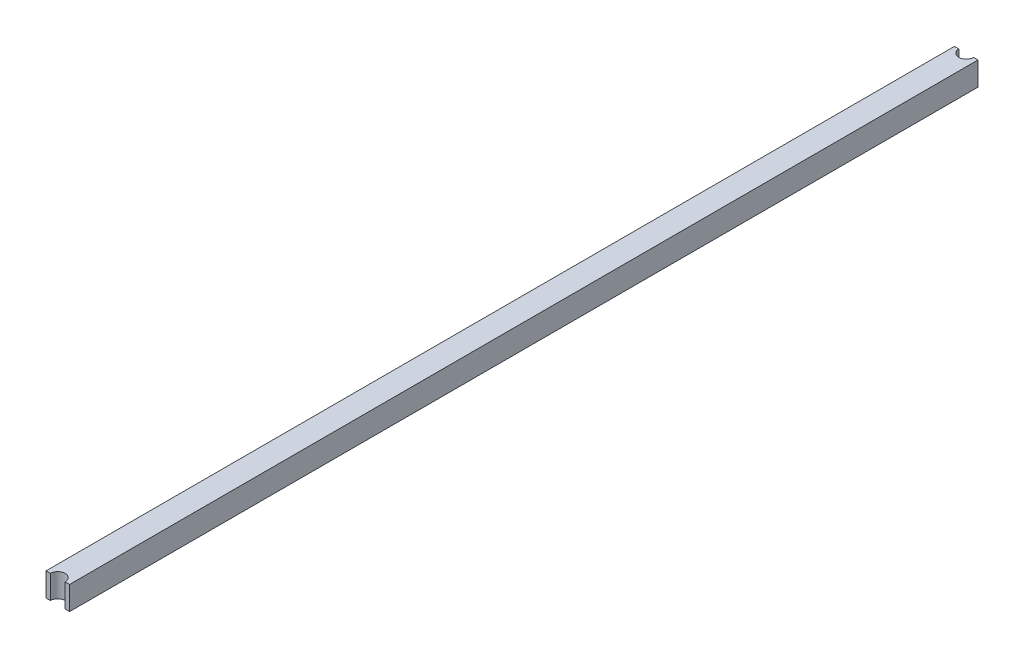
ISO-10303-21;
HEADER;
FILE_DESCRIPTION(('STEP AP214'),'2;1');
FILE_NAME('part.step','',(''),(''),'','','');
FILE_SCHEMA(('AUTOMOTIVE_DESIGN { 1 0 10303 214 1 1 1 1 }'));
ENDSEC;
DATA;
#1=APPLICATION_CONTEXT('core data for automotive mechanical design processes');
#2=APPLICATION_PROTOCOL_DEFINITION('international standard','automotive_design',2000,#1);
#3=PRODUCT_CONTEXT('',#1,'mechanical');
#4=PRODUCT('Part','Part','',(#3));
#5=PRODUCT_RELATED_PRODUCT_CATEGORY('part','',(#4));
#6=PRODUCT_DEFINITION_FORMATION('','',#4);
#7=PRODUCT_DEFINITION_CONTEXT('part definition',#1,'design');
#8=PRODUCT_DEFINITION('design','',#6,#7);
#9=PRODUCT_DEFINITION_SHAPE('','',#8);
#10=(LENGTH_UNIT() NAMED_UNIT(*) SI_UNIT(.MILLI.,.METRE.));
#11=(NAMED_UNIT(*) PLANE_ANGLE_UNIT() SI_UNIT($,.RADIAN.));
#12=(NAMED_UNIT(*) SI_UNIT($,.STERADIAN.) SOLID_ANGLE_UNIT());
#13=UNCERTAINTY_MEASURE_WITH_UNIT(LENGTH_MEASURE(1.E-05),#10,'distance_accuracy_value','');
#14=(GEOMETRIC_REPRESENTATION_CONTEXT(3) GLOBAL_UNCERTAINTY_ASSIGNED_CONTEXT((#13)) GLOBAL_UNIT_ASSIGNED_CONTEXT((#10,
#11,#12)) REPRESENTATION_CONTEXT('',''));
#15=CARTESIAN_POINT('',(0.,0.,0.));
#16=DIRECTION('',(0.,0.,1.));
#17=DIRECTION('',(1.,0.,0.));
#18=AXIS2_PLACEMENT_3D('',#15,#16,#17);
#19=CARTESIAN_POINT('',(0.,0.,1200.));
#20=DIRECTION('',(0.,0.,1.));
#21=DIRECTION('',(1.,0.,0.));
#22=AXIS2_PLACEMENT_3D('',#19,#20,#21);
#23=PLANE('',#22);
#24=DIRECTION('',(0.,1.,0.));
#25=VECTOR('',#24,1.);
#26=CARTESIAN_POINT('',(-5.79500000000002,0.,1200.));
#27=LINE('',#26,#25);
#28=CARTESIAN_POINT('',(-5.79500000000002,0.,1200.));
#29=VERTEX_POINT('',#28);
#30=CARTESIAN_POINT('',(-5.79500000000002,31.1,1200.));
#31=VERTEX_POINT('',#30);
#32=EDGE_CURVE('E11',#29,#31,#27,.T.);
#33=ORIENTED_EDGE('',*,*,#32,.F.);
#34=DIRECTION('',(1.,0.,0.));
#35=VECTOR('',#34,1.);
#36=CARTESIAN_POINT('',(-31.1,0.,1200.));
#37=LINE('',#36,#35);
#38=CARTESIAN_POINT('',(0.,0.,1200.));
#39=VERTEX_POINT('',#38);
#40=EDGE_CURVE('E154',#29,#39,#37,.T.);
#41=ORIENTED_EDGE('',*,*,#40,.T.);
#42=DIRECTION('',(0.,1.,0.));
#43=VECTOR('',#42,1.);
#44=CARTESIAN_POINT('',(0.,31.1,1200.));
#45=LINE('',#44,#43);
#46=CARTESIAN_POINT('',(0.,31.1,1200.));
#47=VERTEX_POINT('',#46);
#48=EDGE_CURVE('E159',#39,#47,#45,.T.);
#49=ORIENTED_EDGE('',*,*,#48,.T.);
#50=DIRECTION('',(-1.,0.,0.));
#51=VECTOR('',#50,1.);
#52=CARTESIAN_POINT('',(-31.1,31.1,1200.));
#53=LINE('',#52,#51);
#54=EDGE_CURVE('E135',#47,#31,#53,.T.);
#55=ORIENTED_EDGE('',*,*,#54,.T.);
#56=EDGE_LOOP('',(#33,#41,#49,#55));
#57=FACE_BOUND('',#56,.T.);
#58=ADVANCED_FACE('F38',(#57),#23,.T.);
#59=CARTESIAN_POINT('',(0.,0.,0.));
#60=DIRECTION('',(0.,0.,1.));
#61=DIRECTION('',(1.,0.,0.));
#62=AXIS2_PLACEMENT_3D('',#59,#60,#61);
#63=PLANE('',#62);
#64=DIRECTION('',(1.,0.,0.));
#65=VECTOR('',#64,1.);
#66=CARTESIAN_POINT('',(-31.1,0.,0.));
#67=LINE('',#66,#65);
#68=CARTESIAN_POINT('',(-5.79499999999999,0.,0.));
#69=VERTEX_POINT('',#68);
#70=CARTESIAN_POINT('',(0.,0.,0.));
#71=VERTEX_POINT('',#70);
#72=EDGE_CURVE('E168',#69,#71,#67,.T.);
#73=ORIENTED_EDGE('',*,*,#72,.F.);
#74=DIRECTION('',(0.,1.,0.));
#75=VECTOR('',#74,1.);
#76=CARTESIAN_POINT('',(-5.79499999999999,0.,0.));
#77=LINE('',#76,#75);
#78=CARTESIAN_POINT('',(-5.79499999999999,31.1,0.));
#79=VERTEX_POINT('',#78);
#80=EDGE_CURVE('E107',#69,#79,#77,.T.);
#81=ORIENTED_EDGE('',*,*,#80,.T.);
#82=DIRECTION('',(-1.,0.,0.));
#83=VECTOR('',#82,1.);
#84=CARTESIAN_POINT('',(-31.1,31.1,0.));
#85=LINE('',#84,#83);
#86=CARTESIAN_POINT('',(0.,31.1,0.));
#87=VERTEX_POINT('',#86);
#88=EDGE_CURVE('E119',#87,#79,#85,.T.);
#89=ORIENTED_EDGE('',*,*,#88,.F.);
#90=DIRECTION('',(0.,1.,0.));
#91=VECTOR('',#90,1.);
#92=CARTESIAN_POINT('',(0.,31.1,0.));
#93=LINE('',#92,#91);
#94=EDGE_CURVE('E125',#71,#87,#93,.T.);
#95=ORIENTED_EDGE('',*,*,#94,.F.);
#96=EDGE_LOOP('',(#73,#81,#89,#95));
#97=FACE_BOUND('',#96,.T.);
#98=ADVANCED_FACE('F176',(#97),#63,.F.);
#99=CARTESIAN_POINT('',(-31.1,31.1,1200.));
#100=DIRECTION('',(1.,0.,0.));
#101=DIRECTION('',(0.,1.,0.));
#102=AXIS2_PLACEMENT_3D('',#99,#100,#101);
#103=PLANE('',#102);
#104=DIRECTION('',(0.,-1.,0.));
#105=VECTOR('',#104,1.);
#106=CARTESIAN_POINT('',(-31.1,31.1,0.));
#107=LINE('',#106,#105);
#108=CARTESIAN_POINT('',(-31.1,31.1,0.));
#109=VERTEX_POINT('',#108);
#110=CARTESIAN_POINT('',(-31.1,0.,0.));
#111=VERTEX_POINT('',#110);
#112=EDGE_CURVE('E124',#109,#111,#107,.T.);
#113=ORIENTED_EDGE('',*,*,#112,.T.);
#114=DIRECTION('',(0.,0.,-1.));
#115=VECTOR('',#114,1.);
#116=CARTESIAN_POINT('',(-31.1,0.,1200.));
#117=LINE('',#116,#115);
#118=CARTESIAN_POINT('',(-31.1,0.,1200.));
#119=VERTEX_POINT('',#118);
#120=EDGE_CURVE('E108',#119,#111,#117,.T.);
#121=ORIENTED_EDGE('',*,*,#120,.F.);
#122=DIRECTION('',(0.,-1.,0.));
#123=VECTOR('',#122,1.);
#124=CARTESIAN_POINT('',(-31.1,31.1,1200.));
#125=LINE('',#124,#123);
#126=CARTESIAN_POINT('',(-31.1,31.1,1200.));
#127=VERTEX_POINT('',#126);
#128=EDGE_CURVE('E127',#127,#119,#125,.T.);
#129=ORIENTED_EDGE('',*,*,#128,.F.);
#130=DIRECTION('',(0.,0.,-1.));
#131=VECTOR('',#130,1.);
#132=CARTESIAN_POINT('',(-31.1,31.1,1200.));
#133=LINE('',#132,#131);
#134=EDGE_CURVE('E132',#127,#109,#133,.T.);
#135=ORIENTED_EDGE('',*,*,#134,.T.);
#136=EDGE_LOOP('',(#113,#121,#129,#135));
#137=FACE_BOUND('',#136,.T.);
#138=ADVANCED_FACE('F40',(#137),#103,.F.);
#139=CARTESIAN_POINT('',(-31.1,0.,1200.));
#140=DIRECTION('',(0.,1.,0.));
#141=DIRECTION('',(-1.,0.,0.));
#142=AXIS2_PLACEMENT_3D('',#139,#140,#141);
#143=PLANE('',#142);
#144=ORIENTED_EDGE('',*,*,#40,.F.);
#145=CARTESIAN_POINT('',(-15.55,0.,1200.));
#146=DIRECTION('',(0.,1.,0.));
#147=DIRECTION('',(-1.,0.,0.));
#148=AXIS2_PLACEMENT_3D('',#145,#146,#147);
#149=CIRCLE('',#148,9.75499999999997);
#150=CARTESIAN_POINT('',(-25.305,0.,1200.));
#151=VERTEX_POINT('',#150);
#152=EDGE_CURVE('E144',#29,#151,#149,.T.);
#153=ORIENTED_EDGE('',*,*,#152,.T.);
#154=EDGE_CURVE('E151',#119,#151,#37,.T.);
#155=ORIENTED_EDGE('',*,*,#154,.F.);
#156=ORIENTED_EDGE('',*,*,#120,.T.);
#157=CARTESIAN_POINT('',(-25.305,0.,0.));
#158=VERTEX_POINT('',#157);
#159=EDGE_CURVE('E128',#111,#158,#67,.T.);
#160=ORIENTED_EDGE('',*,*,#159,.T.);
#161=CARTESIAN_POINT('',(-15.55,0.,0.));
#162=DIRECTION('',(0.,1.,0.));
#163=DIRECTION('',(-1.,0.,0.));
#164=AXIS2_PLACEMENT_3D('',#161,#162,#163);
#165=CIRCLE('',#164,9.755);
#166=EDGE_CURVE('E60',#158,#69,#165,.T.);
#167=ORIENTED_EDGE('',*,*,#166,.T.);
#168=ORIENTED_EDGE('',*,*,#72,.T.);
#169=DIRECTION('',(0.,0.,-1.));
#170=VECTOR('',#169,1.);
#171=CARTESIAN_POINT('',(0.,0.,1200.));
#172=LINE('',#171,#170);
#173=EDGE_CURVE('E137',#39,#71,#172,.T.);
#174=ORIENTED_EDGE('',*,*,#173,.F.);
#175=EDGE_LOOP('',(#144,#153,#155,#156,#160,#167,#168,#174));
#176=FACE_BOUND('',#175,.T.);
#177=ADVANCED_FACE('F150',(#176),#143,.F.);
#178=CARTESIAN_POINT('',(0.,31.1,1200.));
#179=DIRECTION('',(-1.,0.,0.));
#180=DIRECTION('',(0.,-1.,0.));
#181=AXIS2_PLACEMENT_3D('',#178,#179,#180);
#182=PLANE('',#181);
#183=ORIENTED_EDGE('',*,*,#94,.T.);
#184=DIRECTION('',(0.,0.,-1.));
#185=VECTOR('',#184,1.);
#186=CARTESIAN_POINT('',(0.,31.1,1200.));
#187=LINE('',#186,#185);
#188=EDGE_CURVE('E134',#47,#87,#187,.T.);
#189=ORIENTED_EDGE('',*,*,#188,.F.);
#190=ORIENTED_EDGE('',*,*,#48,.F.);
#191=ORIENTED_EDGE('',*,*,#173,.T.);
#192=EDGE_LOOP('',(#183,#189,#190,#191));
#193=FACE_BOUND('',#192,.T.);
#194=ADVANCED_FACE('F174',(#193),#182,.F.);
#195=CARTESIAN_POINT('',(-31.1,31.1,1200.));
#196=DIRECTION('',(0.,-1.,0.));
#197=DIRECTION('',(1.,0.,0.));
#198=AXIS2_PLACEMENT_3D('',#195,#196,#197);
#199=PLANE('',#198);
#200=CARTESIAN_POINT('',(-25.305,31.1,1200.));
#201=VERTEX_POINT('',#200);
#202=EDGE_CURVE('E161',#201,#127,#53,.T.);
#203=ORIENTED_EDGE('',*,*,#202,.F.);
#204=CARTESIAN_POINT('',(-15.55,31.1,1200.));
#205=DIRECTION('',(0.,1.,0.));
#206=DIRECTION('',(-1.,0.,0.));
#207=AXIS2_PLACEMENT_3D('',#204,#205,#206);
#208=CIRCLE('',#207,9.75499999999997);
#209=EDGE_CURVE('E52',#31,#201,#208,.T.);
#210=ORIENTED_EDGE('',*,*,#209,.F.);
#211=ORIENTED_EDGE('',*,*,#54,.F.);
#212=ORIENTED_EDGE('',*,*,#188,.T.);
#213=ORIENTED_EDGE('',*,*,#88,.T.);
#214=CARTESIAN_POINT('',(-15.55,31.1,0.));
#215=DIRECTION('',(0.,1.,0.));
#216=DIRECTION('',(-1.,0.,0.));
#217=AXIS2_PLACEMENT_3D('',#214,#215,#216);
#218=CIRCLE('',#217,9.755);
#219=CARTESIAN_POINT('',(-25.305,31.1,0.));
#220=VERTEX_POINT('',#219);
#221=EDGE_CURVE('E102',#220,#79,#218,.T.);
#222=ORIENTED_EDGE('',*,*,#221,.F.);
#223=EDGE_CURVE('E115',#220,#109,#85,.T.);
#224=ORIENTED_EDGE('',*,*,#223,.T.);
#225=ORIENTED_EDGE('',*,*,#134,.F.);
#226=EDGE_LOOP('',(#203,#210,#211,#212,#213,#222,#224,#225));
#227=FACE_BOUND('',#226,.T.);
#228=ADVANCED_FACE('F113',(#227),#199,.F.);
#229=DIRECTION('',(0.,1.,0.));
#230=VECTOR('',#229,1.);
#231=CARTESIAN_POINT('',(-25.305,0.,1200.));
#232=LINE('',#231,#230);
#233=EDGE_CURVE('E46',#201,#151,#232,.F.);
#234=ORIENTED_EDGE('',*,*,#233,.F.);
#235=ORIENTED_EDGE('',*,*,#202,.T.);
#236=ORIENTED_EDGE('',*,*,#128,.T.);
#237=ORIENTED_EDGE('',*,*,#154,.T.);
#238=EDGE_LOOP('',(#234,#235,#236,#237));
#239=FACE_BOUND('',#238,.T.);
#240=ADVANCED_FACE('F156',(#239),#23,.T.);
#241=ORIENTED_EDGE('',*,*,#223,.F.);
#242=DIRECTION('',(0.,1.,0.));
#243=VECTOR('',#242,1.);
#244=CARTESIAN_POINT('',(-25.305,0.,0.));
#245=LINE('',#244,#243);
#246=EDGE_CURVE('E99',#220,#158,#245,.F.);
#247=ORIENTED_EDGE('',*,*,#246,.T.);
#248=ORIENTED_EDGE('',*,*,#159,.F.);
#249=ORIENTED_EDGE('',*,*,#112,.F.);
#250=EDGE_LOOP('',(#241,#247,#248,#249));
#251=FACE_BOUND('',#250,.T.);
#252=ADVANCED_FACE('F122',(#251),#63,.F.);
#253=CARTESIAN_POINT('',(-15.55,0.,0.));
#254=DIRECTION('',(0.,1.,0.));
#255=DIRECTION('',(-1.,0.,0.));
#256=AXIS2_PLACEMENT_3D('',#253,#254,#255);
#257=CYLINDRICAL_SURFACE('',#256,9.755);
#258=ORIENTED_EDGE('',*,*,#166,.F.);
#259=ORIENTED_EDGE('',*,*,#246,.F.);
#260=ORIENTED_EDGE('',*,*,#221,.T.);
#261=ORIENTED_EDGE('',*,*,#80,.F.);
#262=EDGE_LOOP('',(#258,#259,#260,#261));
#263=FACE_BOUND('',#262,.T.);
#264=ADVANCED_FACE('F101',(#263),#257,.F.);
#265=CARTESIAN_POINT('',(-15.55,0.,1200.));
#266=DIRECTION('',(0.,1.,0.));
#267=DIRECTION('',(-1.,0.,0.));
#268=AXIS2_PLACEMENT_3D('',#265,#266,#267);
#269=CYLINDRICAL_SURFACE('',#268,9.75499999999997);
#270=ORIENTED_EDGE('',*,*,#32,.T.);
#271=ORIENTED_EDGE('',*,*,#209,.T.);
#272=ORIENTED_EDGE('',*,*,#233,.T.);
#273=ORIENTED_EDGE('',*,*,#152,.F.);
#274=EDGE_LOOP('',(#270,#271,#272,#273));
#275=FACE_BOUND('',#274,.T.);
#276=ADVANCED_FACE('F143',(#275),#269,.F.);
#277=CLOSED_SHELL('',(#58,#98,#138,#177,#194,#228,#240,#252,#264,#276));
#278=MANIFOLD_SOLID_BREP('B2',#277);
#279=ADVANCED_BREP_SHAPE_REPRESENTATION('',(#18,#278),#14);
#280=SHAPE_DEFINITION_REPRESENTATION(#9,#279);
ENDSEC;
END-ISO-10303-21;
